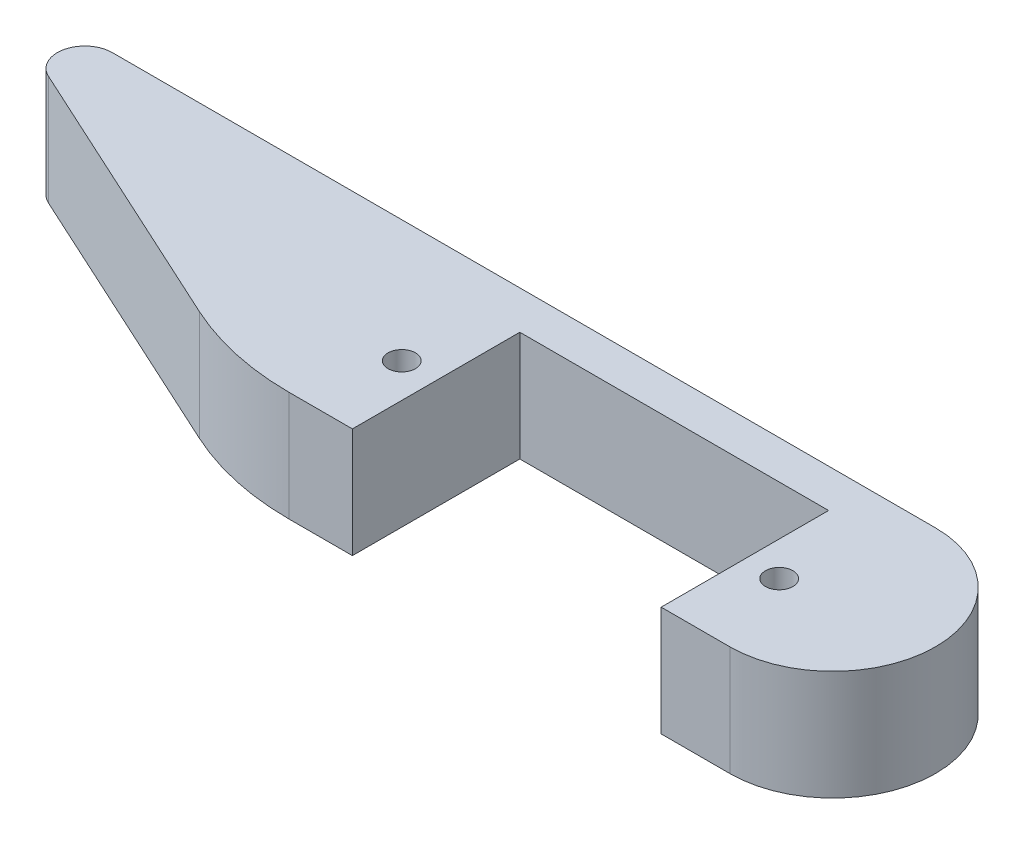
ISO-10303-21;
HEADER;
FILE_DESCRIPTION(('STEP AP214'),'2;1');
FILE_NAME('part.step','',(''),(''),'','','');
FILE_SCHEMA(('AUTOMOTIVE_DESIGN { 1 0 10303 214 1 1 1 1 }'));
ENDSEC;
DATA;
#1=APPLICATION_CONTEXT('core data for automotive mechanical design processes');
#2=APPLICATION_PROTOCOL_DEFINITION('international standard','automotive_design',2000,#1);
#3=PRODUCT_CONTEXT('',#1,'mechanical');
#4=PRODUCT('Part','Part','',(#3));
#5=PRODUCT_RELATED_PRODUCT_CATEGORY('part','',(#4));
#6=PRODUCT_DEFINITION_FORMATION('','',#4);
#7=PRODUCT_DEFINITION_CONTEXT('part definition',#1,'design');
#8=PRODUCT_DEFINITION('design','',#6,#7);
#9=PRODUCT_DEFINITION_SHAPE('','',#8);
#10=(LENGTH_UNIT() NAMED_UNIT(*) SI_UNIT(.MILLI.,.METRE.));
#11=(NAMED_UNIT(*) PLANE_ANGLE_UNIT() SI_UNIT($,.RADIAN.));
#12=(NAMED_UNIT(*) SI_UNIT($,.STERADIAN.) SOLID_ANGLE_UNIT());
#13=UNCERTAINTY_MEASURE_WITH_UNIT(LENGTH_MEASURE(1.E-05),#10,'distance_accuracy_value','');
#14=(GEOMETRIC_REPRESENTATION_CONTEXT(3) GLOBAL_UNCERTAINTY_ASSIGNED_CONTEXT((#13)) GLOBAL_UNIT_ASSIGNED_CONTEXT((#10,
#11,#12)) REPRESENTATION_CONTEXT('',''));
#15=CARTESIAN_POINT('',(0.,0.,0.));
#16=DIRECTION('',(0.,0.,1.));
#17=DIRECTION('',(1.,0.,0.));
#18=AXIS2_PLACEMENT_3D('',#15,#16,#17);
#19=CARTESIAN_POINT('',(-27.1243037321913,8.,-20.));
#20=DIRECTION('',(0.,1.,0.));
#21=DIRECTION('',(0.,0.,1.));
#22=AXIS2_PLACEMENT_3D('',#19,#20,#21);
#23=PLANE('',#22);
#24=CARTESIAN_POINT('',(-25.,8.,-6.1));
#25=DIRECTION('',(0.,1.,0.));
#26=DIRECTION('',(0.,0.,1.));
#27=AXIS2_PLACEMENT_3D('',#24,#25,#26);
#28=CIRCLE('',#27,1.);
#29=CARTESIAN_POINT('',(-25.,8.,-5.1));
#30=VERTEX_POINT('',#29);
#31=EDGE_CURVE('E145',#30,#30,#28,.T.);
#32=ORIENTED_EDGE('',*,*,#31,.F.);
#33=EDGE_LOOP('',(#32));
#34=FACE_BOUND('',#33,.T.);
#35=DIRECTION('',(1.,0.,0.));
#36=VECTOR('',#35,1.);
#37=CARTESIAN_POINT('',(5.,8.,0.));
#38=LINE('',#37,#36);
#39=CARTESIAN_POINT('',(0.,8.,0.));
#40=VERTEX_POINT('',#39);
#41=CARTESIAN_POINT('',(5.,8.,0.));
#42=VERTEX_POINT('',#41);
#43=EDGE_CURVE('E160',#40,#42,#38,.T.);
#44=ORIENTED_EDGE('',*,*,#43,.T.);
#45=CARTESIAN_POINT('',(5.,8.,-7.5));
#46=DIRECTION('',(0.,1.,0.));
#47=DIRECTION('',(0.,0.,1.));
#48=AXIS2_PLACEMENT_3D('',#45,#46,#47);
#49=CIRCLE('',#48,7.5);
#50=CARTESIAN_POINT('',(5.,8.,-15.));
#51=VERTEX_POINT('',#50);
#52=EDGE_CURVE('E98',#42,#51,#49,.T.);
#53=ORIENTED_EDGE('',*,*,#52,.T.);
#54=DIRECTION('',(-1.,0.,0.));
#55=VECTOR('',#54,1.);
#56=CARTESIAN_POINT('',(5.,8.,-15.));
#57=LINE('',#56,#55);
#58=CARTESIAN_POINT('',(-55.,8.,-15.));
#59=VERTEX_POINT('',#58);
#60=EDGE_CURVE('E181',#51,#59,#57,.T.);
#61=ORIENTED_EDGE('',*,*,#60,.T.);
#62=CARTESIAN_POINT('',(-55.,8.,-13.));
#63=DIRECTION('',(0.,1.,0.));
#64=DIRECTION('',(0.,0.,1.));
#65=AXIS2_PLACEMENT_3D('',#62,#63,#64);
#66=CIRCLE('',#65,2.);
#67=CARTESIAN_POINT('',(-55.8350939483654,8.,-11.1826893228169));
#68=VERTEX_POINT('',#67);
#69=EDGE_CURVE('E200',#59,#68,#66,.T.);
#70=ORIENTED_EDGE('',*,*,#69,.T.);
#71=DIRECTION('',(0.908655338591524,0.,0.417546974182694));
#72=VECTOR('',#71,1.);
#73=CARTESIAN_POINT('',(-55.8350939483654,8.,-11.1826893228169));
#74=LINE('',#73,#72);
#75=CARTESIAN_POINT('',(-35.4752432158452,8.,-1.82689322816953));
#76=VERTEX_POINT('',#75);
#77=EDGE_CURVE('E197',#68,#76,#74,.T.);
#78=ORIENTED_EDGE('',*,*,#77,.T.);
#79=CARTESIAN_POINT('',(-27.1243037321913,8.,-20.));
#80=DIRECTION('',(0.,1.,0.));
#81=DIRECTION('',(0.,0.,1.));
#82=AXIS2_PLACEMENT_3D('',#79,#80,#81);
#83=CIRCLE('',#82,20.);
#84=CARTESIAN_POINT('',(-27.1243037321913,8.,0.));
#85=VERTEX_POINT('',#84);
#86=EDGE_CURVE('E199',#76,#85,#83,.T.);
#87=ORIENTED_EDGE('',*,*,#86,.T.);
#88=DIRECTION('',(1.,0.,0.));
#89=VECTOR('',#88,1.);
#90=CARTESIAN_POINT('',(-27.1243037321913,8.,0.));
#91=LINE('',#90,#89);
#92=CARTESIAN_POINT('',(-22.5,8.,0.));
#93=VERTEX_POINT('',#92);
#94=EDGE_CURVE('E123',#85,#93,#91,.T.);
#95=ORIENTED_EDGE('',*,*,#94,.T.);
#96=DIRECTION('',(0.,0.,-1.));
#97=VECTOR('',#96,1.);
#98=CARTESIAN_POINT('',(-22.5,8.,-12.2));
#99=LINE('',#98,#97);
#100=CARTESIAN_POINT('',(-22.5,8.,-12.2));
#101=VERTEX_POINT('',#100);
#102=EDGE_CURVE('E117',#93,#101,#99,.T.);
#103=ORIENTED_EDGE('',*,*,#102,.T.);
#104=DIRECTION('',(1.,0.,0.));
#105=VECTOR('',#104,1.);
#106=CARTESIAN_POINT('',(0.,8.,-12.2));
#107=LINE('',#106,#105);
#108=CARTESIAN_POINT('',(0.,8.,-12.2));
#109=VERTEX_POINT('',#108);
#110=EDGE_CURVE('E121',#101,#109,#107,.T.);
#111=ORIENTED_EDGE('',*,*,#110,.T.);
#112=DIRECTION('',(0.,0.,1.));
#113=VECTOR('',#112,1.);
#114=CARTESIAN_POINT('',(0.,8.,0.));
#115=LINE('',#114,#113);
#116=EDGE_CURVE('E49',#109,#40,#115,.T.);
#117=ORIENTED_EDGE('',*,*,#116,.T.);
#118=EDGE_LOOP('',(#44,#53,#61,#70,#78,#87,#95,#103,#111,#117));
#119=FACE_BOUND('',#118,.T.);
#120=CARTESIAN_POINT('',(2.5,8.,-6.1));
#121=DIRECTION('',(0.,1.,0.));
#122=DIRECTION('',(0.,0.,1.));
#123=AXIS2_PLACEMENT_3D('',#120,#121,#122);
#124=CIRCLE('',#123,1.);
#125=CARTESIAN_POINT('',(2.5,8.,-5.1));
#126=VERTEX_POINT('',#125);
#127=EDGE_CURVE('E211',#126,#126,#124,.T.);
#128=ORIENTED_EDGE('',*,*,#127,.F.);
#129=EDGE_LOOP('',(#128));
#130=FACE_BOUND('',#129,.T.);
#131=ADVANCED_FACE('F32',(#34,#119,#130),#23,.T.);
#132=CARTESIAN_POINT('',(-27.1243037321913,0.,-20.));
#133=DIRECTION('',(0.,1.,0.));
#134=DIRECTION('',(0.,0.,1.));
#135=AXIS2_PLACEMENT_3D('',#132,#133,#134);
#136=PLANE('',#135);
#137=CARTESIAN_POINT('',(-25.,0.,-6.1));
#138=DIRECTION('',(0.,1.,0.));
#139=DIRECTION('',(0.,0.,1.));
#140=AXIS2_PLACEMENT_3D('',#137,#138,#139);
#141=CIRCLE('',#140,1.);
#142=CARTESIAN_POINT('',(-25.,0.,-5.1));
#143=VERTEX_POINT('',#142);
#144=EDGE_CURVE('E208',#143,#143,#141,.T.);
#145=ORIENTED_EDGE('',*,*,#144,.T.);
#146=EDGE_LOOP('',(#145));
#147=FACE_BOUND('',#146,.T.);
#148=DIRECTION('',(1.,0.,0.));
#149=VECTOR('',#148,1.);
#150=CARTESIAN_POINT('',(5.,0.,0.));
#151=LINE('',#150,#149);
#152=CARTESIAN_POINT('',(0.,0.,0.));
#153=VERTEX_POINT('',#152);
#154=CARTESIAN_POINT('',(5.,0.,0.));
#155=VERTEX_POINT('',#154);
#156=EDGE_CURVE('E141',#153,#155,#151,.T.);
#157=ORIENTED_EDGE('',*,*,#156,.F.);
#158=DIRECTION('',(0.,0.,1.));
#159=VECTOR('',#158,1.);
#160=CARTESIAN_POINT('',(0.,0.,0.));
#161=LINE('',#160,#159);
#162=CARTESIAN_POINT('',(0.,0.,-12.2));
#163=VERTEX_POINT('',#162);
#164=EDGE_CURVE('E90',#163,#153,#161,.T.);
#165=ORIENTED_EDGE('',*,*,#164,.F.);
#166=DIRECTION('',(1.,0.,0.));
#167=VECTOR('',#166,1.);
#168=CARTESIAN_POINT('',(0.,0.,-12.2));
#169=LINE('',#168,#167);
#170=CARTESIAN_POINT('',(-22.5,0.,-12.2));
#171=VERTEX_POINT('',#170);
#172=EDGE_CURVE('E84',#171,#163,#169,.T.);
#173=ORIENTED_EDGE('',*,*,#172,.F.);
#174=DIRECTION('',(0.,0.,-1.));
#175=VECTOR('',#174,1.);
#176=CARTESIAN_POINT('',(-22.5,0.,-12.2));
#177=LINE('',#176,#175);
#178=CARTESIAN_POINT('',(-22.5,0.,0.));
#179=VERTEX_POINT('',#178);
#180=EDGE_CURVE('E131',#179,#171,#177,.T.);
#181=ORIENTED_EDGE('',*,*,#180,.F.);
#182=DIRECTION('',(1.,0.,0.));
#183=VECTOR('',#182,1.);
#184=CARTESIAN_POINT('',(-27.1243037321913,0.,0.));
#185=LINE('',#184,#183);
#186=CARTESIAN_POINT('',(-27.1243037321913,0.,0.));
#187=VERTEX_POINT('',#186);
#188=EDGE_CURVE('E155',#187,#179,#185,.T.);
#189=ORIENTED_EDGE('',*,*,#188,.F.);
#190=CARTESIAN_POINT('',(-27.1243037321913,0.,-20.));
#191=DIRECTION('',(0.,1.,0.));
#192=DIRECTION('',(0.,0.,1.));
#193=AXIS2_PLACEMENT_3D('',#190,#191,#192);
#194=CIRCLE('',#193,20.);
#195=CARTESIAN_POINT('',(-35.4752432158452,0.,-1.82689322816953));
#196=VERTEX_POINT('',#195);
#197=EDGE_CURVE('E153',#196,#187,#194,.T.);
#198=ORIENTED_EDGE('',*,*,#197,.F.);
#199=DIRECTION('',(0.908655338591524,0.,0.417546974182694));
#200=VECTOR('',#199,1.);
#201=CARTESIAN_POINT('',(-55.8350939483654,0.,-11.1826893228169));
#202=LINE('',#201,#200);
#203=CARTESIAN_POINT('',(-55.8350939483654,0.,-11.1826893228169));
#204=VERTEX_POINT('',#203);
#205=EDGE_CURVE('E151',#204,#196,#202,.T.);
#206=ORIENTED_EDGE('',*,*,#205,.F.);
#207=CARTESIAN_POINT('',(-55.,0.,-13.));
#208=DIRECTION('',(0.,1.,0.));
#209=DIRECTION('',(0.,0.,1.));
#210=AXIS2_PLACEMENT_3D('',#207,#208,#209);
#211=CIRCLE('',#210,2.);
#212=CARTESIAN_POINT('',(-55.,0.,-15.));
#213=VERTEX_POINT('',#212);
#214=EDGE_CURVE('E149',#213,#204,#211,.T.);
#215=ORIENTED_EDGE('',*,*,#214,.F.);
#216=DIRECTION('',(-1.,0.,0.));
#217=VECTOR('',#216,1.);
#218=CARTESIAN_POINT('',(5.,0.,-15.));
#219=LINE('',#218,#217);
#220=CARTESIAN_POINT('',(5.,0.,-15.));
#221=VERTEX_POINT('',#220);
#222=EDGE_CURVE('E147',#221,#213,#219,.T.);
#223=ORIENTED_EDGE('',*,*,#222,.F.);
#224=CARTESIAN_POINT('',(5.,0.,-7.5));
#225=DIRECTION('',(0.,1.,0.));
#226=DIRECTION('',(0.,0.,1.));
#227=AXIS2_PLACEMENT_3D('',#224,#225,#226);
#228=CIRCLE('',#227,7.5);
#229=EDGE_CURVE('E144',#155,#221,#228,.T.);
#230=ORIENTED_EDGE('',*,*,#229,.F.);
#231=EDGE_LOOP('',(#157,#165,#173,#181,#189,#198,#206,#215,#223,#230));
#232=FACE_BOUND('',#231,.T.);
#233=CARTESIAN_POINT('',(2.5,0.,-6.1));
#234=DIRECTION('',(0.,1.,0.));
#235=DIRECTION('',(0.,0.,1.));
#236=AXIS2_PLACEMENT_3D('',#233,#234,#235);
#237=CIRCLE('',#236,1.);
#238=CARTESIAN_POINT('',(2.5,0.,-5.1));
#239=VERTEX_POINT('',#238);
#240=EDGE_CURVE('E214',#239,#239,#237,.T.);
#241=ORIENTED_EDGE('',*,*,#240,.T.);
#242=EDGE_LOOP('',(#241));
#243=FACE_BOUND('',#242,.T.);
#244=ADVANCED_FACE('F185',(#147,#232,#243),#136,.F.);
#245=CARTESIAN_POINT('',(5.,8.,0.));
#246=DIRECTION('',(0.,0.,-1.));
#247=DIRECTION('',(-1.,0.,0.));
#248=AXIS2_PLACEMENT_3D('',#245,#246,#247);
#249=PLANE('',#248);
#250=ORIENTED_EDGE('',*,*,#156,.T.);
#251=DIRECTION('',(0.,-1.,0.));
#252=VECTOR('',#251,1.);
#253=CARTESIAN_POINT('',(5.,8.,0.));
#254=LINE('',#253,#252);
#255=EDGE_CURVE('E11',#42,#155,#254,.T.);
#256=ORIENTED_EDGE('',*,*,#255,.F.);
#257=ORIENTED_EDGE('',*,*,#43,.F.);
#258=DIRECTION('',(0.,-1.,0.));
#259=VECTOR('',#258,1.);
#260=CARTESIAN_POINT('',(0.,8.,0.));
#261=LINE('',#260,#259);
#262=EDGE_CURVE('E137',#40,#153,#261,.T.);
#263=ORIENTED_EDGE('',*,*,#262,.T.);
#264=EDGE_LOOP('',(#250,#256,#257,#263));
#265=FACE_BOUND('',#264,.T.);
#266=ADVANCED_FACE('F34',(#265),#249,.F.);
#267=CARTESIAN_POINT('',(5.,8.,-7.5));
#268=DIRECTION('',(0.,-1.,0.));
#269=DIRECTION('',(0.,0.,-1.));
#270=AXIS2_PLACEMENT_3D('',#267,#268,#269);
#271=CYLINDRICAL_SURFACE('',#270,7.5);
#272=ORIENTED_EDGE('',*,*,#229,.T.);
#273=DIRECTION('',(0.,-1.,0.));
#274=VECTOR('',#273,1.);
#275=CARTESIAN_POINT('',(5.,8.,-15.));
#276=LINE('',#275,#274);
#277=EDGE_CURVE('E41',#51,#221,#276,.T.);
#278=ORIENTED_EDGE('',*,*,#277,.F.);
#279=ORIENTED_EDGE('',*,*,#52,.F.);
#280=ORIENTED_EDGE('',*,*,#255,.T.);
#281=EDGE_LOOP('',(#272,#278,#279,#280));
#282=FACE_BOUND('',#281,.T.);
#283=ADVANCED_FACE('F255',(#282),#271,.T.);
#284=CARTESIAN_POINT('',(5.,8.,-15.));
#285=DIRECTION('',(0.,0.,1.));
#286=DIRECTION('',(1.,0.,0.));
#287=AXIS2_PLACEMENT_3D('',#284,#285,#286);
#288=PLANE('',#287);
#289=ORIENTED_EDGE('',*,*,#222,.T.);
#290=DIRECTION('',(0.,-1.,0.));
#291=VECTOR('',#290,1.);
#292=CARTESIAN_POINT('',(-55.,8.,-15.));
#293=LINE('',#292,#291);
#294=EDGE_CURVE('E173',#59,#213,#293,.T.);
#295=ORIENTED_EDGE('',*,*,#294,.F.);
#296=ORIENTED_EDGE('',*,*,#60,.F.);
#297=ORIENTED_EDGE('',*,*,#277,.T.);
#298=EDGE_LOOP('',(#289,#295,#296,#297));
#299=FACE_BOUND('',#298,.T.);
#300=ADVANCED_FACE('F179',(#299),#288,.F.);
#301=CARTESIAN_POINT('',(-55.,8.,-13.));
#302=DIRECTION('',(0.,-1.,0.));
#303=DIRECTION('',(0.,0.,-1.));
#304=AXIS2_PLACEMENT_3D('',#301,#302,#303);
#305=CYLINDRICAL_SURFACE('',#304,2.);
#306=ORIENTED_EDGE('',*,*,#214,.T.);
#307=DIRECTION('',(0.,-1.,0.));
#308=VECTOR('',#307,1.);
#309=CARTESIAN_POINT('',(-55.8350939483654,8.,-11.1826893228169));
#310=LINE('',#309,#308);
#311=EDGE_CURVE('E170',#68,#204,#310,.T.);
#312=ORIENTED_EDGE('',*,*,#311,.F.);
#313=ORIENTED_EDGE('',*,*,#69,.F.);
#314=ORIENTED_EDGE('',*,*,#294,.T.);
#315=EDGE_LOOP('',(#306,#312,#313,#314));
#316=FACE_BOUND('',#315,.T.);
#317=ADVANCED_FACE('F191',(#316),#305,.T.);
#318=CARTESIAN_POINT('',(-55.8350939483654,8.,-11.1826893228169));
#319=DIRECTION('',(0.417546974182694,0.,-0.908655338591524));
#320=DIRECTION('',(-0.908655338591524,0.,-0.417546974182694));
#321=AXIS2_PLACEMENT_3D('',#318,#319,#320);
#322=PLANE('',#321);
#323=ORIENTED_EDGE('',*,*,#205,.T.);
#324=DIRECTION('',(0.,-1.,0.));
#325=VECTOR('',#324,1.);
#326=CARTESIAN_POINT('',(-35.4752432158452,8.,-1.82689322816953));
#327=LINE('',#326,#325);
#328=EDGE_CURVE('E167',#76,#196,#327,.T.);
#329=ORIENTED_EDGE('',*,*,#328,.F.);
#330=ORIENTED_EDGE('',*,*,#77,.F.);
#331=ORIENTED_EDGE('',*,*,#311,.T.);
#332=EDGE_LOOP('',(#323,#329,#330,#331));
#333=FACE_BOUND('',#332,.T.);
#334=ADVANCED_FACE('F195',(#333),#322,.F.);
#335=CARTESIAN_POINT('',(-27.1243037321913,8.,-20.));
#336=DIRECTION('',(0.,-1.,0.));
#337=DIRECTION('',(0.,0.,-1.));
#338=AXIS2_PLACEMENT_3D('',#335,#336,#337);
#339=CYLINDRICAL_SURFACE('',#338,20.);
#340=ORIENTED_EDGE('',*,*,#197,.T.);
#341=DIRECTION('',(0.,-1.,0.));
#342=VECTOR('',#341,1.);
#343=CARTESIAN_POINT('',(-27.1243037321913,8.,0.));
#344=LINE('',#343,#342);
#345=EDGE_CURVE('E164',#85,#187,#344,.T.);
#346=ORIENTED_EDGE('',*,*,#345,.F.);
#347=ORIENTED_EDGE('',*,*,#86,.F.);
#348=ORIENTED_EDGE('',*,*,#328,.T.);
#349=EDGE_LOOP('',(#340,#346,#347,#348));
#350=FACE_BOUND('',#349,.T.);
#351=ADVANCED_FACE('F245',(#350),#339,.T.);
#352=CARTESIAN_POINT('',(-27.1243037321913,8.,0.));
#353=DIRECTION('',(0.,0.,-1.));
#354=DIRECTION('',(-1.,0.,0.));
#355=AXIS2_PLACEMENT_3D('',#352,#353,#354);
#356=PLANE('',#355);
#357=ORIENTED_EDGE('',*,*,#188,.T.);
#358=DIRECTION('',(0.,-1.,0.));
#359=VECTOR('',#358,1.);
#360=CARTESIAN_POINT('',(-22.5,8.,0.));
#361=LINE('',#360,#359);
#362=EDGE_CURVE('E132',#93,#179,#361,.T.);
#363=ORIENTED_EDGE('',*,*,#362,.F.);
#364=ORIENTED_EDGE('',*,*,#94,.F.);
#365=ORIENTED_EDGE('',*,*,#345,.T.);
#366=EDGE_LOOP('',(#357,#363,#364,#365));
#367=FACE_BOUND('',#366,.T.);
#368=ADVANCED_FACE('F242',(#367),#356,.F.);
#369=CARTESIAN_POINT('',(-22.5,8.,-12.2));
#370=DIRECTION('',(-1.,0.,0.));
#371=DIRECTION('',(0.,0.,1.));
#372=AXIS2_PLACEMENT_3D('',#369,#370,#371);
#373=PLANE('',#372);
#374=ORIENTED_EDGE('',*,*,#180,.T.);
#375=DIRECTION('',(0.,-1.,0.));
#376=VECTOR('',#375,1.);
#377=CARTESIAN_POINT('',(-22.5,8.,-12.2));
#378=LINE('',#377,#376);
#379=EDGE_CURVE('E128',#101,#171,#378,.T.);
#380=ORIENTED_EDGE('',*,*,#379,.F.);
#381=ORIENTED_EDGE('',*,*,#102,.F.);
#382=ORIENTED_EDGE('',*,*,#362,.T.);
#383=EDGE_LOOP('',(#374,#380,#381,#382));
#384=FACE_BOUND('',#383,.T.);
#385=ADVANCED_FACE('F129',(#384),#373,.F.);
#386=CARTESIAN_POINT('',(0.,8.,-12.2));
#387=DIRECTION('',(0.,0.,-1.));
#388=DIRECTION('',(-1.,0.,0.));
#389=AXIS2_PLACEMENT_3D('',#386,#387,#388);
#390=PLANE('',#389);
#391=ORIENTED_EDGE('',*,*,#172,.T.);
#392=DIRECTION('',(0.,-1.,0.));
#393=VECTOR('',#392,1.);
#394=CARTESIAN_POINT('',(0.,8.,-12.2));
#395=LINE('',#394,#393);
#396=EDGE_CURVE('E133',#109,#163,#395,.T.);
#397=ORIENTED_EDGE('',*,*,#396,.F.);
#398=ORIENTED_EDGE('',*,*,#110,.F.);
#399=ORIENTED_EDGE('',*,*,#379,.T.);
#400=EDGE_LOOP('',(#391,#397,#398,#399));
#401=FACE_BOUND('',#400,.T.);
#402=ADVANCED_FACE('F135',(#401),#390,.F.);
#403=CARTESIAN_POINT('',(0.,8.,0.));
#404=DIRECTION('',(1.,0.,0.));
#405=DIRECTION('',(0.,0.,-1.));
#406=AXIS2_PLACEMENT_3D('',#403,#404,#405);
#407=PLANE('',#406);
#408=ORIENTED_EDGE('',*,*,#164,.T.);
#409=ORIENTED_EDGE('',*,*,#262,.F.);
#410=ORIENTED_EDGE('',*,*,#116,.F.);
#411=ORIENTED_EDGE('',*,*,#396,.T.);
#412=EDGE_LOOP('',(#408,#409,#410,#411));
#413=FACE_BOUND('',#412,.T.);
#414=ADVANCED_FACE('F235',(#413),#407,.F.);
#415=CARTESIAN_POINT('',(-25.,8.,-6.1));
#416=DIRECTION('',(0.,-1.,0.));
#417=DIRECTION('',(0.,0.,-1.));
#418=AXIS2_PLACEMENT_3D('',#415,#416,#417);
#419=CYLINDRICAL_SURFACE('',#418,1.);
#420=ORIENTED_EDGE('',*,*,#31,.T.);
#421=EDGE_LOOP('',(#420));
#422=FACE_BOUND('',#421,.T.);
#423=ORIENTED_EDGE('',*,*,#144,.F.);
#424=EDGE_LOOP('',(#423));
#425=FACE_BOUND('',#424,.T.);
#426=ADVANCED_FACE('F232',(#422,#425),#419,.F.);
#427=CARTESIAN_POINT('',(2.5,8.,-6.1));
#428=DIRECTION('',(0.,-1.,0.));
#429=DIRECTION('',(0.,0.,-1.));
#430=AXIS2_PLACEMENT_3D('',#427,#428,#429);
#431=CYLINDRICAL_SURFACE('',#430,1.);
#432=ORIENTED_EDGE('',*,*,#127,.T.);
#433=EDGE_LOOP('',(#432));
#434=FACE_BOUND('',#433,.T.);
#435=ORIENTED_EDGE('',*,*,#240,.F.);
#436=EDGE_LOOP('',(#435));
#437=FACE_BOUND('',#436,.T.);
#438=ADVANCED_FACE('F220',(#434,#437),#431,.F.);
#439=CLOSED_SHELL('',(#131,#244,#266,#283,#300,#317,#334,#351,#368,#385,#402,#414,#426,#438));
#440=MANIFOLD_SOLID_BREP('B2',#439);
#441=ADVANCED_BREP_SHAPE_REPRESENTATION('',(#18,#440),#14);
#442=SHAPE_DEFINITION_REPRESENTATION(#9,#441);
ENDSEC;
END-ISO-10303-21;
